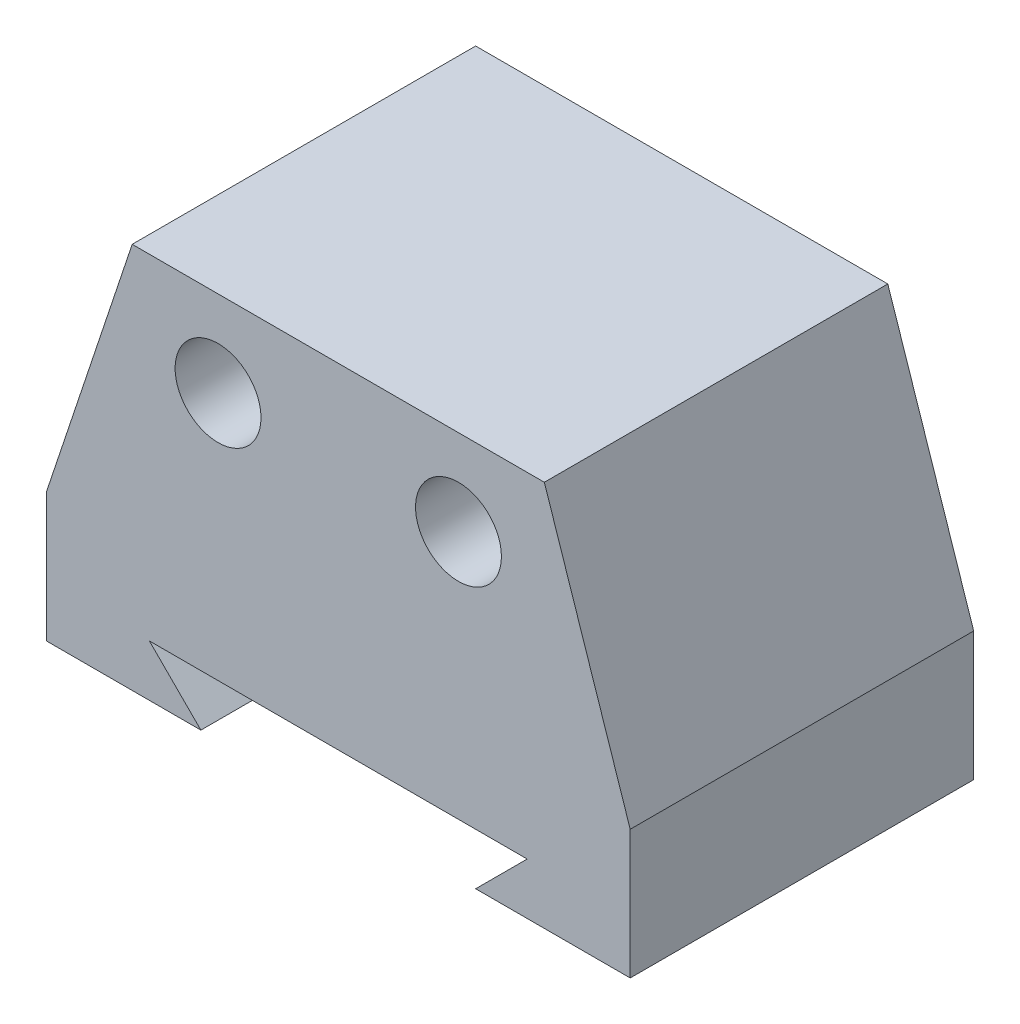
ISO-10303-21;
HEADER;
FILE_DESCRIPTION(('STEP AP214'),'2;1');
FILE_NAME('part.step','',(''),(''),'','','');
FILE_SCHEMA(('AUTOMOTIVE_DESIGN { 1 0 10303 214 1 1 1 1 }'));
ENDSEC;
DATA;
#1=APPLICATION_CONTEXT('core data for automotive mechanical design processes');
#2=APPLICATION_PROTOCOL_DEFINITION('international standard','automotive_design',2000,#1);
#3=PRODUCT_CONTEXT('',#1,'mechanical');
#4=PRODUCT('Part','Part','',(#3));
#5=PRODUCT_RELATED_PRODUCT_CATEGORY('part','',(#4));
#6=PRODUCT_DEFINITION_FORMATION('','',#4);
#7=PRODUCT_DEFINITION_CONTEXT('part definition',#1,'design');
#8=PRODUCT_DEFINITION('design','',#6,#7);
#9=PRODUCT_DEFINITION_SHAPE('','',#8);
#10=(LENGTH_UNIT() NAMED_UNIT(*) SI_UNIT(.MILLI.,.METRE.));
#11=(NAMED_UNIT(*) PLANE_ANGLE_UNIT() SI_UNIT($,.RADIAN.));
#12=(NAMED_UNIT(*) SI_UNIT($,.STERADIAN.) SOLID_ANGLE_UNIT());
#13=UNCERTAINTY_MEASURE_WITH_UNIT(LENGTH_MEASURE(1.E-05),#10,'distance_accuracy_value','');
#14=(GEOMETRIC_REPRESENTATION_CONTEXT(3) GLOBAL_UNCERTAINTY_ASSIGNED_CONTEXT((#13)) GLOBAL_UNIT_ASSIGNED_CONTEXT((#10,
#11,#12)) REPRESENTATION_CONTEXT('',''));
#15=CARTESIAN_POINT('',(0.,0.,0.));
#16=DIRECTION('',(0.,0.,1.));
#17=DIRECTION('',(1.,0.,0.));
#18=AXIS2_PLACEMENT_3D('',#15,#16,#17);
#19=CARTESIAN_POINT('',(0.,0.,40.));
#20=DIRECTION('',(0.,0.,1.));
#21=DIRECTION('',(1.,0.,0.));
#22=AXIS2_PLACEMENT_3D('',#19,#20,#21);
#23=PLANE('',#22);
#24=CARTESIAN_POINT('',(-14.,35.,40.));
#25=DIRECTION('',(0.,0.,1.));
#26=DIRECTION('',(1.,0.,0.));
#27=AXIS2_PLACEMENT_3D('',#24,#25,#26);
#28=CIRCLE('',#27,5.);
#29=CARTESIAN_POINT('',(-9.00000000000001,35.,40.));
#30=VERTEX_POINT('',#29);
#31=EDGE_CURVE('E150',#30,#30,#28,.T.);
#32=ORIENTED_EDGE('',*,*,#31,.F.);
#33=EDGE_LOOP('',(#32));
#34=FACE_BOUND('',#33,.T.);
#35=DIRECTION('',(-0.707106781186546,-0.707106781186549,0.));
#36=VECTOR('',#35,1.);
#37=CARTESIAN_POINT('',(22.,6.,40.));
#38=LINE('',#37,#36);
#39=CARTESIAN_POINT('',(22.,6.,40.));
#40=VERTEX_POINT('',#39);
#41=CARTESIAN_POINT('',(16.,0.,40.));
#42=VERTEX_POINT('',#41);
#43=EDGE_CURVE('E165',#40,#42,#38,.T.);
#44=ORIENTED_EDGE('',*,*,#43,.T.);
#45=DIRECTION('',(1.,0.,0.));
#46=VECTOR('',#45,1.);
#47=CARTESIAN_POINT('',(16.,0.,40.));
#48=LINE('',#47,#46);
#49=CARTESIAN_POINT('',(34.,0.,40.));
#50=VERTEX_POINT('',#49);
#51=EDGE_CURVE('E103',#42,#50,#48,.T.);
#52=ORIENTED_EDGE('',*,*,#51,.T.);
#53=DIRECTION('',(0.,1.,0.));
#54=VECTOR('',#53,1.);
#55=CARTESIAN_POINT('',(34.,0.,40.));
#56=LINE('',#55,#54);
#57=CARTESIAN_POINT('',(34.,15.,40.));
#58=VERTEX_POINT('',#57);
#59=EDGE_CURVE('E186',#50,#58,#56,.T.);
#60=ORIENTED_EDGE('',*,*,#59,.T.);
#61=DIRECTION('',(-0.316227766016838,0.948683298050514,0.));
#62=VECTOR('',#61,1.);
#63=CARTESIAN_POINT('',(34.,15.,40.));
#64=LINE('',#63,#62);
#65=CARTESIAN_POINT('',(24.,45.,40.));
#66=VERTEX_POINT('',#65);
#67=EDGE_CURVE('E205',#58,#66,#64,.T.);
#68=ORIENTED_EDGE('',*,*,#67,.T.);
#69=DIRECTION('',(-1.,0.,0.));
#70=VECTOR('',#69,1.);
#71=CARTESIAN_POINT('',(24.,45.,40.));
#72=LINE('',#71,#70);
#73=CARTESIAN_POINT('',(-24.,45.,40.));
#74=VERTEX_POINT('',#73);
#75=EDGE_CURVE('E202',#66,#74,#72,.T.);
#76=ORIENTED_EDGE('',*,*,#75,.T.);
#77=DIRECTION('',(-0.316227766016838,-0.948683298050514,0.));
#78=VECTOR('',#77,1.);
#79=CARTESIAN_POINT('',(-34.,15.,40.));
#80=LINE('',#79,#78);
#81=CARTESIAN_POINT('',(-34.,15.,40.));
#82=VERTEX_POINT('',#81);
#83=EDGE_CURVE('E204',#74,#82,#80,.T.);
#84=ORIENTED_EDGE('',*,*,#83,.T.);
#85=DIRECTION('',(0.,-1.,0.));
#86=VECTOR('',#85,1.);
#87=CARTESIAN_POINT('',(-34.,0.,40.));
#88=LINE('',#87,#86);
#89=CARTESIAN_POINT('',(-34.,0.,40.));
#90=VERTEX_POINT('',#89);
#91=EDGE_CURVE('E128',#82,#90,#88,.T.);
#92=ORIENTED_EDGE('',*,*,#91,.T.);
#93=DIRECTION('',(1.,0.,0.));
#94=VECTOR('',#93,1.);
#95=CARTESIAN_POINT('',(-16.,0.,40.));
#96=LINE('',#95,#94);
#97=CARTESIAN_POINT('',(-16.,0.,40.));
#98=VERTEX_POINT('',#97);
#99=EDGE_CURVE('E122',#90,#98,#96,.T.);
#100=ORIENTED_EDGE('',*,*,#99,.T.);
#101=DIRECTION('',(-0.707106781186546,0.707106781186549,0.));
#102=VECTOR('',#101,1.);
#103=CARTESIAN_POINT('',(-22.,6.,40.));
#104=LINE('',#103,#102);
#105=CARTESIAN_POINT('',(-22.,6.,40.));
#106=VERTEX_POINT('',#105);
#107=EDGE_CURVE('E126',#98,#106,#104,.T.);
#108=ORIENTED_EDGE('',*,*,#107,.T.);
#109=DIRECTION('',(1.,0.,0.));
#110=VECTOR('',#109,1.);
#111=CARTESIAN_POINT('',(-22.,6.,40.));
#112=LINE('',#111,#110);
#113=EDGE_CURVE('E54',#106,#40,#112,.T.);
#114=ORIENTED_EDGE('',*,*,#113,.T.);
#115=EDGE_LOOP('',(#44,#52,#60,#68,#76,#84,#92,#100,#108,#114));
#116=FACE_BOUND('',#115,.T.);
#117=CARTESIAN_POINT('',(14.,35.,40.));
#118=DIRECTION('',(0.,0.,1.));
#119=DIRECTION('',(1.,0.,0.));
#120=AXIS2_PLACEMENT_3D('',#117,#118,#119);
#121=CIRCLE('',#120,5.);
#122=CARTESIAN_POINT('',(19.,35.,40.));
#123=VERTEX_POINT('',#122);
#124=EDGE_CURVE('E216',#123,#123,#121,.T.);
#125=ORIENTED_EDGE('',*,*,#124,.F.);
#126=EDGE_LOOP('',(#125));
#127=FACE_BOUND('',#126,.T.);
#128=ADVANCED_FACE('F37',(#34,#116,#127),#23,.T.);
#129=CARTESIAN_POINT('',(0.,0.,0.));
#130=DIRECTION('',(0.,0.,1.));
#131=DIRECTION('',(1.,0.,0.));
#132=AXIS2_PLACEMENT_3D('',#129,#130,#131);
#133=PLANE('',#132);
#134=DIRECTION('',(-0.707106781186546,-0.707106781186549,0.));
#135=VECTOR('',#134,1.);
#136=CARTESIAN_POINT('',(22.,6.,0.));
#137=LINE('',#136,#135);
#138=CARTESIAN_POINT('',(22.,6.,0.));
#139=VERTEX_POINT('',#138);
#140=CARTESIAN_POINT('',(16.,0.,0.));
#141=VERTEX_POINT('',#140);
#142=EDGE_CURVE('E146',#139,#141,#137,.T.);
#143=ORIENTED_EDGE('',*,*,#142,.F.);
#144=DIRECTION('',(1.,0.,0.));
#145=VECTOR('',#144,1.);
#146=CARTESIAN_POINT('',(-22.,6.,0.));
#147=LINE('',#146,#145);
#148=CARTESIAN_POINT('',(-22.,6.,0.));
#149=VERTEX_POINT('',#148);
#150=EDGE_CURVE('E95',#149,#139,#147,.T.);
#151=ORIENTED_EDGE('',*,*,#150,.F.);
#152=DIRECTION('',(-0.707106781186546,0.707106781186549,0.));
#153=VECTOR('',#152,1.);
#154=CARTESIAN_POINT('',(-22.,6.,0.));
#155=LINE('',#154,#153);
#156=CARTESIAN_POINT('',(-16.,0.,0.));
#157=VERTEX_POINT('',#156);
#158=EDGE_CURVE('E89',#157,#149,#155,.T.);
#159=ORIENTED_EDGE('',*,*,#158,.F.);
#160=DIRECTION('',(1.,0.,0.));
#161=VECTOR('',#160,1.);
#162=CARTESIAN_POINT('',(-16.,0.,0.));
#163=LINE('',#162,#161);
#164=CARTESIAN_POINT('',(-34.,0.,0.));
#165=VERTEX_POINT('',#164);
#166=EDGE_CURVE('E136',#165,#157,#163,.T.);
#167=ORIENTED_EDGE('',*,*,#166,.F.);
#168=DIRECTION('',(0.,-1.,0.));
#169=VECTOR('',#168,1.);
#170=CARTESIAN_POINT('',(-34.,0.,0.));
#171=LINE('',#170,#169);
#172=CARTESIAN_POINT('',(-34.,15.,0.));
#173=VERTEX_POINT('',#172);
#174=EDGE_CURVE('E160',#173,#165,#171,.T.);
#175=ORIENTED_EDGE('',*,*,#174,.F.);
#176=DIRECTION('',(-0.316227766016838,-0.948683298050514,0.));
#177=VECTOR('',#176,1.);
#178=CARTESIAN_POINT('',(-34.,15.,0.));
#179=LINE('',#178,#177);
#180=CARTESIAN_POINT('',(-24.,45.,0.));
#181=VERTEX_POINT('',#180);
#182=EDGE_CURVE('E158',#181,#173,#179,.T.);
#183=ORIENTED_EDGE('',*,*,#182,.F.);
#184=DIRECTION('',(-1.,0.,0.));
#185=VECTOR('',#184,1.);
#186=CARTESIAN_POINT('',(24.,45.,0.));
#187=LINE('',#186,#185);
#188=CARTESIAN_POINT('',(24.,45.,0.));
#189=VERTEX_POINT('',#188);
#190=EDGE_CURVE('E156',#189,#181,#187,.T.);
#191=ORIENTED_EDGE('',*,*,#190,.F.);
#192=DIRECTION('',(-0.316227766016838,0.948683298050514,0.));
#193=VECTOR('',#192,1.);
#194=CARTESIAN_POINT('',(34.,15.,0.));
#195=LINE('',#194,#193);
#196=CARTESIAN_POINT('',(34.,15.,0.));
#197=VERTEX_POINT('',#196);
#198=EDGE_CURVE('E154',#197,#189,#195,.T.);
#199=ORIENTED_EDGE('',*,*,#198,.F.);
#200=DIRECTION('',(0.,1.,0.));
#201=VECTOR('',#200,1.);
#202=CARTESIAN_POINT('',(34.,0.,0.));
#203=LINE('',#202,#201);
#204=CARTESIAN_POINT('',(34.,0.,0.));
#205=VERTEX_POINT('',#204);
#206=EDGE_CURVE('E152',#205,#197,#203,.T.);
#207=ORIENTED_EDGE('',*,*,#206,.F.);
#208=DIRECTION('',(1.,0.,0.));
#209=VECTOR('',#208,1.);
#210=CARTESIAN_POINT('',(16.,0.,0.));
#211=LINE('',#210,#209);
#212=EDGE_CURVE('E149',#141,#205,#211,.T.);
#213=ORIENTED_EDGE('',*,*,#212,.F.);
#214=EDGE_LOOP('',(#143,#151,#159,#167,#175,#183,#191,#199,#207,#213));
#215=FACE_BOUND('',#214,.T.);
#216=CARTESIAN_POINT('',(-14.,35.,0.));
#217=DIRECTION('',(0.,0.,1.));
#218=DIRECTION('',(1.,0.,0.));
#219=AXIS2_PLACEMENT_3D('',#216,#217,#218);
#220=CIRCLE('',#219,5.);
#221=CARTESIAN_POINT('',(-9.00000000000001,35.,0.));
#222=VERTEX_POINT('',#221);
#223=EDGE_CURVE('E213',#222,#222,#220,.T.);
#224=ORIENTED_EDGE('',*,*,#223,.T.);
#225=EDGE_LOOP('',(#224));
#226=FACE_BOUND('',#225,.T.);
#227=CARTESIAN_POINT('',(14.,35.,0.));
#228=DIRECTION('',(0.,0.,1.));
#229=DIRECTION('',(1.,0.,0.));
#230=AXIS2_PLACEMENT_3D('',#227,#228,#229);
#231=CIRCLE('',#230,5.);
#232=CARTESIAN_POINT('',(19.,35.,0.));
#233=VERTEX_POINT('',#232);
#234=EDGE_CURVE('E219',#233,#233,#231,.T.);
#235=ORIENTED_EDGE('',*,*,#234,.T.);
#236=EDGE_LOOP('',(#235));
#237=FACE_BOUND('',#236,.T.);
#238=ADVANCED_FACE('F190',(#215,#226,#237),#133,.F.);
#239=CARTESIAN_POINT('',(22.,6.,40.));
#240=DIRECTION('',(0.707106781186549,-0.707106781186546,0.));
#241=DIRECTION('',(0.707106781186546,0.707106781186549,0.));
#242=AXIS2_PLACEMENT_3D('',#239,#240,#241);
#243=PLANE('',#242);
#244=ORIENTED_EDGE('',*,*,#142,.T.);
#245=DIRECTION('',(0.,0.,-1.));
#246=VECTOR('',#245,1.);
#247=CARTESIAN_POINT('',(16.,0.,40.));
#248=LINE('',#247,#246);
#249=EDGE_CURVE('E11',#42,#141,#248,.T.);
#250=ORIENTED_EDGE('',*,*,#249,.F.);
#251=ORIENTED_EDGE('',*,*,#43,.F.);
#252=DIRECTION('',(0.,0.,-1.));
#253=VECTOR('',#252,1.);
#254=CARTESIAN_POINT('',(22.,6.,40.));
#255=LINE('',#254,#253);
#256=EDGE_CURVE('E142',#40,#139,#255,.T.);
#257=ORIENTED_EDGE('',*,*,#256,.T.);
#258=EDGE_LOOP('',(#244,#250,#251,#257));
#259=FACE_BOUND('',#258,.T.);
#260=ADVANCED_FACE('F39',(#259),#243,.F.);
#261=CARTESIAN_POINT('',(16.,0.,40.));
#262=DIRECTION('',(0.,1.,0.));
#263=DIRECTION('',(0.,0.,1.));
#264=AXIS2_PLACEMENT_3D('',#261,#262,#263);
#265=PLANE('',#264);
#266=ORIENTED_EDGE('',*,*,#212,.T.);
#267=DIRECTION('',(0.,0.,-1.));
#268=VECTOR('',#267,1.);
#269=CARTESIAN_POINT('',(34.,0.,40.));
#270=LINE('',#269,#268);
#271=EDGE_CURVE('E46',#50,#205,#270,.T.);
#272=ORIENTED_EDGE('',*,*,#271,.F.);
#273=ORIENTED_EDGE('',*,*,#51,.F.);
#274=ORIENTED_EDGE('',*,*,#249,.T.);
#275=EDGE_LOOP('',(#266,#272,#273,#274));
#276=FACE_BOUND('',#275,.T.);
#277=ADVANCED_FACE('F259',(#276),#265,.F.);
#278=CARTESIAN_POINT('',(34.,0.,40.));
#279=DIRECTION('',(-1.,0.,0.));
#280=DIRECTION('',(0.,0.,1.));
#281=AXIS2_PLACEMENT_3D('',#278,#279,#280);
#282=PLANE('',#281);
#283=ORIENTED_EDGE('',*,*,#206,.T.);
#284=DIRECTION('',(0.,0.,-1.));
#285=VECTOR('',#284,1.);
#286=CARTESIAN_POINT('',(34.,15.,40.));
#287=LINE('',#286,#285);
#288=EDGE_CURVE('E178',#58,#197,#287,.T.);
#289=ORIENTED_EDGE('',*,*,#288,.F.);
#290=ORIENTED_EDGE('',*,*,#59,.F.);
#291=ORIENTED_EDGE('',*,*,#271,.T.);
#292=EDGE_LOOP('',(#283,#289,#290,#291));
#293=FACE_BOUND('',#292,.T.);
#294=ADVANCED_FACE('F184',(#293),#282,.F.);
#295=CARTESIAN_POINT('',(34.,15.,40.));
#296=DIRECTION('',(-0.948683298050514,-0.316227766016838,0.));
#297=DIRECTION('',(0.316227766016838,-0.948683298050514,0.));
#298=AXIS2_PLACEMENT_3D('',#295,#296,#297);
#299=PLANE('',#298);
#300=ORIENTED_EDGE('',*,*,#198,.T.);
#301=DIRECTION('',(0.,0.,-1.));
#302=VECTOR('',#301,1.);
#303=CARTESIAN_POINT('',(24.,45.,40.));
#304=LINE('',#303,#302);
#305=EDGE_CURVE('E175',#66,#189,#304,.T.);
#306=ORIENTED_EDGE('',*,*,#305,.F.);
#307=ORIENTED_EDGE('',*,*,#67,.F.);
#308=ORIENTED_EDGE('',*,*,#288,.T.);
#309=EDGE_LOOP('',(#300,#306,#307,#308));
#310=FACE_BOUND('',#309,.T.);
#311=ADVANCED_FACE('F196',(#310),#299,.F.);
#312=CARTESIAN_POINT('',(24.,45.,40.));
#313=DIRECTION('',(0.,-1.,0.));
#314=DIRECTION('',(0.,0.,-1.));
#315=AXIS2_PLACEMENT_3D('',#312,#313,#314);
#316=PLANE('',#315);
#317=ORIENTED_EDGE('',*,*,#190,.T.);
#318=DIRECTION('',(0.,0.,-1.));
#319=VECTOR('',#318,1.);
#320=CARTESIAN_POINT('',(-24.,45.,40.));
#321=LINE('',#320,#319);
#322=EDGE_CURVE('E172',#74,#181,#321,.T.);
#323=ORIENTED_EDGE('',*,*,#322,.F.);
#324=ORIENTED_EDGE('',*,*,#75,.F.);
#325=ORIENTED_EDGE('',*,*,#305,.T.);
#326=EDGE_LOOP('',(#317,#323,#324,#325));
#327=FACE_BOUND('',#326,.T.);
#328=ADVANCED_FACE('F200',(#327),#316,.F.);
#329=CARTESIAN_POINT('',(-34.,15.,40.));
#330=DIRECTION('',(0.948683298050514,-0.316227766016838,0.));
#331=DIRECTION('',(0.316227766016838,0.948683298050514,0.));
#332=AXIS2_PLACEMENT_3D('',#329,#330,#331);
#333=PLANE('',#332);
#334=ORIENTED_EDGE('',*,*,#182,.T.);
#335=DIRECTION('',(0.,0.,-1.));
#336=VECTOR('',#335,1.);
#337=CARTESIAN_POINT('',(-34.,15.,40.));
#338=LINE('',#337,#336);
#339=EDGE_CURVE('E169',#82,#173,#338,.T.);
#340=ORIENTED_EDGE('',*,*,#339,.F.);
#341=ORIENTED_EDGE('',*,*,#83,.F.);
#342=ORIENTED_EDGE('',*,*,#322,.T.);
#343=EDGE_LOOP('',(#334,#340,#341,#342));
#344=FACE_BOUND('',#343,.T.);
#345=ADVANCED_FACE('F249',(#344),#333,.F.);
#346=CARTESIAN_POINT('',(-34.,0.,40.));
#347=DIRECTION('',(1.,0.,0.));
#348=DIRECTION('',(0.,0.,-1.));
#349=AXIS2_PLACEMENT_3D('',#346,#347,#348);
#350=PLANE('',#349);
#351=ORIENTED_EDGE('',*,*,#174,.T.);
#352=DIRECTION('',(0.,0.,-1.));
#353=VECTOR('',#352,1.);
#354=CARTESIAN_POINT('',(-34.,0.,40.));
#355=LINE('',#354,#353);
#356=EDGE_CURVE('E137',#90,#165,#355,.T.);
#357=ORIENTED_EDGE('',*,*,#356,.F.);
#358=ORIENTED_EDGE('',*,*,#91,.F.);
#359=ORIENTED_EDGE('',*,*,#339,.T.);
#360=EDGE_LOOP('',(#351,#357,#358,#359));
#361=FACE_BOUND('',#360,.T.);
#362=ADVANCED_FACE('F246',(#361),#350,.F.);
#363=CARTESIAN_POINT('',(-16.,0.,40.));
#364=DIRECTION('',(0.,1.,0.));
#365=DIRECTION('',(0.,0.,1.));
#366=AXIS2_PLACEMENT_3D('',#363,#364,#365);
#367=PLANE('',#366);
#368=ORIENTED_EDGE('',*,*,#166,.T.);
#369=DIRECTION('',(0.,0.,-1.));
#370=VECTOR('',#369,1.);
#371=CARTESIAN_POINT('',(-16.,0.,40.));
#372=LINE('',#371,#370);
#373=EDGE_CURVE('E133',#98,#157,#372,.T.);
#374=ORIENTED_EDGE('',*,*,#373,.F.);
#375=ORIENTED_EDGE('',*,*,#99,.F.);
#376=ORIENTED_EDGE('',*,*,#356,.T.);
#377=EDGE_LOOP('',(#368,#374,#375,#376));
#378=FACE_BOUND('',#377,.T.);
#379=ADVANCED_FACE('F134',(#378),#367,.F.);
#380=CARTESIAN_POINT('',(-22.,6.,40.));
#381=DIRECTION('',(-0.707106781186549,-0.707106781186546,0.));
#382=DIRECTION('',(0.707106781186546,-0.707106781186549,0.));
#383=AXIS2_PLACEMENT_3D('',#380,#381,#382);
#384=PLANE('',#383);
#385=ORIENTED_EDGE('',*,*,#158,.T.);
#386=DIRECTION('',(0.,0.,-1.));
#387=VECTOR('',#386,1.);
#388=CARTESIAN_POINT('',(-22.,6.,40.));
#389=LINE('',#388,#387);
#390=EDGE_CURVE('E138',#106,#149,#389,.T.);
#391=ORIENTED_EDGE('',*,*,#390,.F.);
#392=ORIENTED_EDGE('',*,*,#107,.F.);
#393=ORIENTED_EDGE('',*,*,#373,.T.);
#394=EDGE_LOOP('',(#385,#391,#392,#393));
#395=FACE_BOUND('',#394,.T.);
#396=ADVANCED_FACE('F140',(#395),#384,.F.);
#397=CARTESIAN_POINT('',(-22.,6.,40.));
#398=DIRECTION('',(0.,1.,0.));
#399=DIRECTION('',(0.,0.,1.));
#400=AXIS2_PLACEMENT_3D('',#397,#398,#399);
#401=PLANE('',#400);
#402=ORIENTED_EDGE('',*,*,#150,.T.);
#403=ORIENTED_EDGE('',*,*,#256,.F.);
#404=ORIENTED_EDGE('',*,*,#113,.F.);
#405=ORIENTED_EDGE('',*,*,#390,.T.);
#406=EDGE_LOOP('',(#402,#403,#404,#405));
#407=FACE_BOUND('',#406,.T.);
#408=ADVANCED_FACE('F239',(#407),#401,.F.);
#409=CARTESIAN_POINT('',(-14.,35.,40.));
#410=DIRECTION('',(0.,0.,-1.));
#411=DIRECTION('',(-1.,0.,0.));
#412=AXIS2_PLACEMENT_3D('',#409,#410,#411);
#413=CYLINDRICAL_SURFACE('',#412,5.);
#414=ORIENTED_EDGE('',*,*,#31,.T.);
#415=EDGE_LOOP('',(#414));
#416=FACE_BOUND('',#415,.T.);
#417=ORIENTED_EDGE('',*,*,#223,.F.);
#418=EDGE_LOOP('',(#417));
#419=FACE_BOUND('',#418,.T.);
#420=ADVANCED_FACE('F236',(#416,#419),#413,.F.);
#421=CARTESIAN_POINT('',(14.,35.,40.));
#422=DIRECTION('',(0.,0.,-1.));
#423=DIRECTION('',(-1.,0.,0.));
#424=AXIS2_PLACEMENT_3D('',#421,#422,#423);
#425=CYLINDRICAL_SURFACE('',#424,5.);
#426=ORIENTED_EDGE('',*,*,#124,.T.);
#427=EDGE_LOOP('',(#426));
#428=FACE_BOUND('',#427,.T.);
#429=ORIENTED_EDGE('',*,*,#234,.F.);
#430=EDGE_LOOP('',(#429));
#431=FACE_BOUND('',#430,.T.);
#432=ADVANCED_FACE('F225',(#428,#431),#425,.F.);
#433=CLOSED_SHELL('',(#128,#238,#260,#277,#294,#311,#328,#345,#362,#379,#396,#408,#420,#432));
#434=MANIFOLD_SOLID_BREP('B2',#433);
#435=ADVANCED_BREP_SHAPE_REPRESENTATION('',(#18,#434),#14);
#436=SHAPE_DEFINITION_REPRESENTATION(#9,#435);
ENDSEC;
END-ISO-10303-21;
